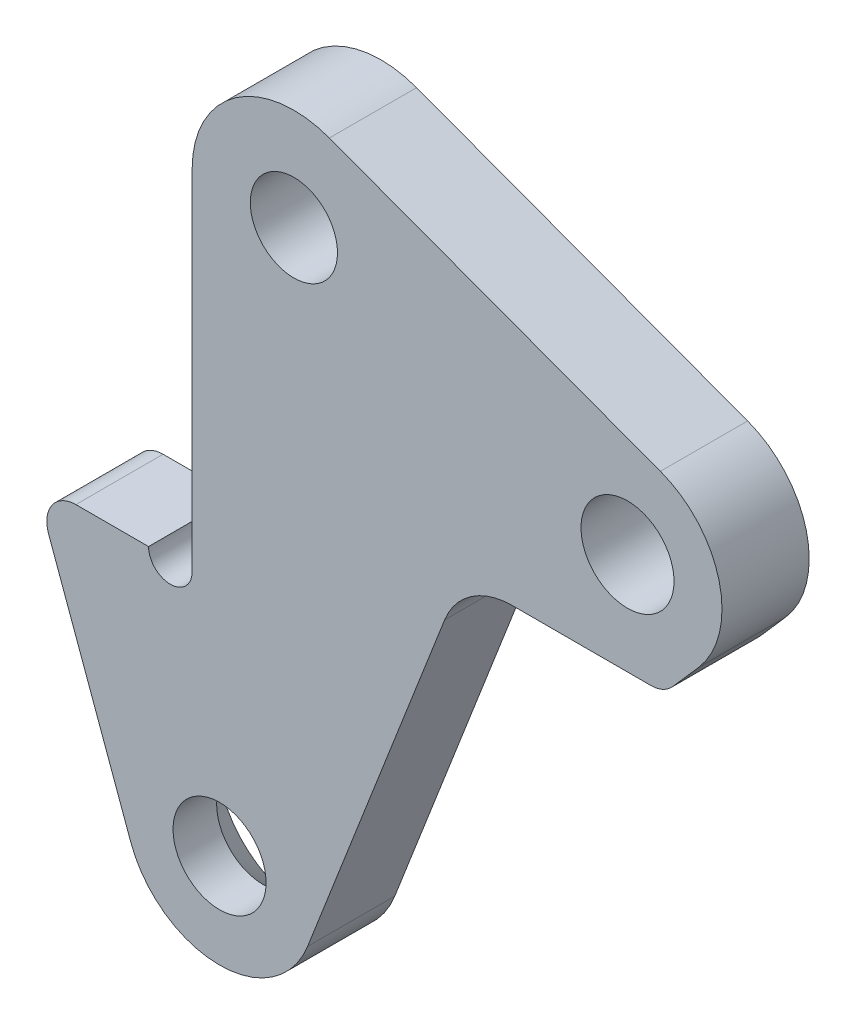
ISO-10303-21;
HEADER;
FILE_DESCRIPTION(('STEP AP214'),'2;1');
FILE_NAME('part.step','',(''),(''),'','','');
FILE_SCHEMA(('AUTOMOTIVE_DESIGN { 1 0 10303 214 1 1 1 1 }'));
ENDSEC;
DATA;
#1=APPLICATION_CONTEXT('core data for automotive mechanical design processes');
#2=APPLICATION_PROTOCOL_DEFINITION('international standard','automotive_design',2000,#1);
#3=PRODUCT_CONTEXT('',#1,'mechanical');
#4=PRODUCT('Part','Part','',(#3));
#5=PRODUCT_RELATED_PRODUCT_CATEGORY('part','',(#4));
#6=PRODUCT_DEFINITION_FORMATION('','',#4);
#7=PRODUCT_DEFINITION_CONTEXT('part definition',#1,'design');
#8=PRODUCT_DEFINITION('design','',#6,#7);
#9=PRODUCT_DEFINITION_SHAPE('','',#8);
#10=(LENGTH_UNIT() NAMED_UNIT(*) SI_UNIT(.MILLI.,.METRE.));
#11=(NAMED_UNIT(*) PLANE_ANGLE_UNIT() SI_UNIT($,.RADIAN.));
#12=(NAMED_UNIT(*) SI_UNIT($,.STERADIAN.) SOLID_ANGLE_UNIT());
#13=UNCERTAINTY_MEASURE_WITH_UNIT(LENGTH_MEASURE(1.E-05),#10,'distance_accuracy_value','');
#14=(GEOMETRIC_REPRESENTATION_CONTEXT(3) GLOBAL_UNCERTAINTY_ASSIGNED_CONTEXT((#13)) GLOBAL_UNIT_ASSIGNED_CONTEXT((#10,
#11,#12)) REPRESENTATION_CONTEXT('',''));
#15=CARTESIAN_POINT('',(0.,0.,0.));
#16=DIRECTION('',(0.,0.,1.));
#17=DIRECTION('',(1.,0.,0.));
#18=AXIS2_PLACEMENT_3D('',#15,#16,#17);
#19=CARTESIAN_POINT('',(0.,0.,1.5));
#20=DIRECTION('',(0.,0.,-1.));
#21=DIRECTION('',(-1.,0.,0.));
#22=AXIS2_PLACEMENT_3D('',#19,#20,#21);
#23=PLANE('',#22);
#24=CARTESIAN_POINT('',(0.,0.,1.5));
#25=DIRECTION('',(0.,0.,1.));
#26=DIRECTION('',(1.,0.,0.));
#27=AXIS2_PLACEMENT_3D('',#24,#25,#26);
#28=CIRCLE('',#27,1.5);
#29=CARTESIAN_POINT('',(1.5,0.,1.5));
#30=VERTEX_POINT('',#29);
#31=EDGE_CURVE('E185',#30,#30,#28,.T.);
#32=ORIENTED_EDGE('',*,*,#31,.F.);
#33=EDGE_LOOP('',(#32));
#34=FACE_BOUND('',#33,.T.);
#35=CARTESIAN_POINT('',(-2.55780837206581,-20.,1.5));
#36=DIRECTION('',(0.,0.,1.));
#37=DIRECTION('',(1.,0.,0.));
#38=AXIS2_PLACEMENT_3D('',#35,#36,#37);
#39=CIRCLE('',#38,1.60000000000001);
#40=CARTESIAN_POINT('',(-0.957808372065798,-20.,1.5));
#41=VERTEX_POINT('',#40);
#42=EDGE_CURVE('E179',#41,#41,#39,.T.);
#43=ORIENTED_EDGE('',*,*,#42,.F.);
#44=EDGE_LOOP('',(#43));
#45=FACE_BOUND('',#44,.T.);
#46=CARTESIAN_POINT('',(11.4771790394003,-4.,1.5));
#47=DIRECTION('',(0.,0.,1.));
#48=DIRECTION('',(1.,0.,0.));
#49=AXIS2_PLACEMENT_3D('',#46,#47,#48);
#50=CIRCLE('',#49,1.6);
#51=CARTESIAN_POINT('',(13.0771790394003,-4.,1.5));
#52=VERTEX_POINT('',#51);
#53=EDGE_CURVE('E176',#52,#52,#50,.T.);
#54=ORIENTED_EDGE('',*,*,#53,.F.);
#55=EDGE_LOOP('',(#54));
#56=FACE_BOUND('',#55,.T.);
#57=DIRECTION('',(-1.,0.,0.));
#58=VECTOR('',#57,1.);
#59=CARTESIAN_POINT('',(5.80742685174699,-7.5,1.5));
#60=LINE('',#59,#58);
#61=CARTESIAN_POINT('',(12.2771829682659,-7.5,1.5));
#62=VERTEX_POINT('',#61);
#63=CARTESIAN_POINT('',(7.51561342335569,-7.5,1.5));
#64=VERTEX_POINT('',#63);
#65=EDGE_CURVE('E148',#62,#64,#60,.T.);
#66=ORIENTED_EDGE('',*,*,#65,.F.);
#67=CARTESIAN_POINT('',(12.2771829682659,-6.5,1.5));
#68=DIRECTION('',(0.,0.,-1.));
#69=DIRECTION('',(-1.,0.,0.));
#70=AXIS2_PLACEMENT_3D('',#67,#68,#69);
#71=CIRCLE('',#70,1.);
#72=CARTESIAN_POINT('',(13.0289444175339,-7.15943515480637,1.5));
#73=VERTEX_POINT('',#72);
#74=EDGE_CURVE('E59',#62,#73,#71,.F.);
#75=ORIENTED_EDGE('',*,*,#74,.T.);
#76=DIRECTION('',(0.659435154806362,0.75176144926799,0.));
#77=VECTOR('',#76,1.);
#78=CARTESIAN_POINT('',(-0.114583661944843,-22.1431642531207,1.5));
#79=LINE('',#78,#77);
#80=CARTESIAN_POINT('',(13.9204037495213,-6.14316425312068,1.5));
#81=VERTEX_POINT('',#80);
#82=EDGE_CURVE('E203',#73,#81,#79,.T.);
#83=ORIENTED_EDGE('',*,*,#82,.T.);
#84=CARTESIAN_POINT('',(11.4771790394003,-4.,1.5));
#85=DIRECTION('',(0.,0.,1.));
#86=DIRECTION('',(1.,0.,0.));
#87=AXIS2_PLACEMENT_3D('',#84,#85,#86);
#88=CIRCLE('',#87,3.25);
#89=CARTESIAN_POINT('',(12.6096632094642,-0.953694105222709,1.5));
#90=VERTEX_POINT('',#89);
#91=EDGE_CURVE('E205',#81,#90,#88,.T.);
#92=ORIENTED_EDGE('',*,*,#91,.T.);
#93=DIRECTION('',(-0.937324890700704,0.348456667711945,0.));
#94=VECTOR('',#93,1.);
#95=CARTESIAN_POINT('',(1.21959833699181,3.28063711745247,1.5));
#96=LINE('',#95,#94);
#97=CARTESIAN_POINT('',(1.21959833699181,3.28063711745247,1.5));
#98=VERTEX_POINT('',#97);
#99=EDGE_CURVE('E207',#90,#98,#96,.T.);
#100=ORIENTED_EDGE('',*,*,#99,.T.);
#101=CARTESIAN_POINT('',(0.,0.,1.5));
#102=DIRECTION('',(0.,0.,1.));
#103=DIRECTION('',(-1.,0.,0.));
#104=AXIS2_PLACEMENT_3D('',#101,#102,#103);
#105=CIRCLE('',#104,3.5);
#106=CARTESIAN_POINT('',(-3.5,0.,1.5));
#107=VERTEX_POINT('',#106);
#108=EDGE_CURVE('E209',#98,#107,#105,.T.);
#109=ORIENTED_EDGE('',*,*,#108,.T.);
#110=DIRECTION('',(0.,-1.,0.));
#111=VECTOR('',#110,1.);
#112=CARTESIAN_POINT('',(-3.5,-12.,1.5));
#113=LINE('',#112,#111);
#114=CARTESIAN_POINT('',(-3.5,-12.,1.5));
#115=VERTEX_POINT('',#114);
#116=EDGE_CURVE('E191',#107,#115,#113,.T.);
#117=ORIENTED_EDGE('',*,*,#116,.T.);
#118=CARTESIAN_POINT('',(-4.25,-12.,1.5));
#119=DIRECTION('',(0.,0.,1.));
#120=DIRECTION('',(1.,0.,0.));
#121=AXIS2_PLACEMENT_3D('',#118,#119,#120);
#122=CIRCLE('',#121,0.75);
#123=CARTESIAN_POINT('',(-5.,-12.,1.5));
#124=VERTEX_POINT('',#123);
#125=EDGE_CURVE('E165',#124,#115,#122,.T.);
#126=ORIENTED_EDGE('',*,*,#125,.F.);
#127=DIRECTION('',(-1.,0.,0.));
#128=VECTOR('',#127,1.);
#129=CARTESIAN_POINT('',(-7.5,-12.,1.5));
#130=LINE('',#129,#128);
#131=CARTESIAN_POINT('',(-7.5,-12.,1.5));
#132=VERTEX_POINT('',#131);
#133=EDGE_CURVE('E194',#124,#132,#130,.T.);
#134=ORIENTED_EDGE('',*,*,#133,.T.);
#135=CARTESIAN_POINT('',(-7.5,-13.,1.5));
#136=DIRECTION('',(0.,0.,1.));
#137=DIRECTION('',(1.,0.,0.));
#138=AXIS2_PLACEMENT_3D('',#135,#136,#137);
#139=CIRCLE('',#138,0.999999999999999);
#140=CARTESIAN_POINT('',(-8.43969262078591,-13.3420201433257,1.5));
#141=VERTEX_POINT('',#140);
#142=EDGE_CURVE('E197',#132,#141,#139,.T.);
#143=ORIENTED_EDGE('',*,*,#142,.T.);
#144=DIRECTION('',(0.342020143325666,-0.939692620785909,0.));
#145=VECTOR('',#144,1.);
#146=CARTESIAN_POINT('',(-8.43969262078591,-13.3420201433257,1.5));
#147=LINE('',#146,#145);
#148=CARTESIAN_POINT('',(-5.61180938962001,-21.1115654658084,1.5));
#149=VERTEX_POINT('',#148);
#150=EDGE_CURVE('E199',#141,#149,#147,.T.);
#151=ORIENTED_EDGE('',*,*,#150,.T.);
#152=CARTESIAN_POINT('',(-2.55780837206581,-20.,1.5));
#153=DIRECTION('',(0.,0.,1.));
#154=DIRECTION('',(1.,0.,0.));
#155=AXIS2_PLACEMENT_3D('',#152,#153,#154);
#156=CIRCLE('',#155,3.25);
#157=CARTESIAN_POINT('',(0.469932731190725,-21.1812213220438,1.5));
#158=VERTEX_POINT('',#157);
#159=EDGE_CURVE('E201',#149,#158,#156,.T.);
#160=ORIENTED_EDGE('',*,*,#159,.T.);
#161=DIRECTION('',(-0.363452714475013,-0.931612647155858,0.));
#162=VECTOR('',#161,1.);
#163=CARTESIAN_POINT('',(0.469932731190727,-21.1812213220438,1.5));
#164=LINE('',#163,#162);
#165=CARTESIAN_POINT('',(5.18658180546604,-9.09136821381247,1.5));
#166=VERTEX_POINT('',#165);
#167=EDGE_CURVE('E163',#166,#158,#164,.T.);
#168=ORIENTED_EDGE('',*,*,#167,.F.);
#169=CARTESIAN_POINT('',(7.51561342335569,-10.,1.5));
#170=DIRECTION('',(0.,0.,-1.));
#171=DIRECTION('',(-1.,0.,0.));
#172=AXIS2_PLACEMENT_3D('',#169,#170,#171);
#173=CIRCLE('',#172,2.5);
#174=EDGE_CURVE('E259',#166,#64,#173,.T.);
#175=ORIENTED_EDGE('',*,*,#174,.T.);
#176=EDGE_LOOP('',(#66,#75,#83,#92,#100,#109,#117,#126,#134,#143,#151,#160,#168,#175));
#177=FACE_BOUND('',#176,.T.);
#178=ADVANCED_FACE('F37',(#34,#45,#56,#177),#23,.F.);
#179=CARTESIAN_POINT('',(0.,0.,-1.5));
#180=DIRECTION('',(0.,0.,-1.));
#181=DIRECTION('',(-1.,0.,0.));
#182=AXIS2_PLACEMENT_3D('',#179,#180,#181);
#183=PLANE('',#182);
#184=CARTESIAN_POINT('',(11.4771790394003,-4.,-1.5));
#185=DIRECTION('',(0.,0.,1.));
#186=DIRECTION('',(1.,0.,0.));
#187=AXIS2_PLACEMENT_3D('',#184,#185,#186);
#188=CIRCLE('',#187,1.6);
#189=CARTESIAN_POINT('',(13.0771790394003,-4.,-1.5));
#190=VERTEX_POINT('',#189);
#191=EDGE_CURVE('E174',#190,#190,#188,.T.);
#192=ORIENTED_EDGE('',*,*,#191,.T.);
#193=EDGE_LOOP('',(#192));
#194=FACE_BOUND('',#193,.T.);
#195=CARTESIAN_POINT('',(0.,0.,-1.5));
#196=DIRECTION('',(0.,0.,1.));
#197=DIRECTION('',(1.,0.,0.));
#198=AXIS2_PLACEMENT_3D('',#195,#196,#197);
#199=CIRCLE('',#198,1.5);
#200=CARTESIAN_POINT('',(1.5,0.,-1.5));
#201=VERTEX_POINT('',#200);
#202=EDGE_CURVE('E184',#201,#201,#199,.T.);
#203=ORIENTED_EDGE('',*,*,#202,.T.);
#204=EDGE_LOOP('',(#203));
#205=FACE_BOUND('',#204,.T.);
#206=CARTESIAN_POINT('',(-2.55780837206581,-20.,-1.5));
#207=DIRECTION('',(0.,0.,-1.));
#208=DIRECTION('',(-1.,0.,0.));
#209=AXIS2_PLACEMENT_3D('',#206,#207,#208);
#210=CIRCLE('',#209,3.10000000000001);
#211=CARTESIAN_POINT('',(-5.65780837206582,-20.,-1.5));
#212=VERTEX_POINT('',#211);
#213=EDGE_CURVE('E245',#212,#212,#210,.F.);
#214=ORIENTED_EDGE('',*,*,#213,.T.);
#215=EDGE_LOOP('',(#214));
#216=FACE_BOUND('',#215,.T.);
#217=DIRECTION('',(0.659435154806362,0.75176144926799,0.));
#218=VECTOR('',#217,1.);
#219=CARTESIAN_POINT('',(-0.114583661944843,-22.1431642531207,-1.5));
#220=LINE('',#219,#218);
#221=CARTESIAN_POINT('',(13.0289444175339,-7.15943515480637,-1.5));
#222=VERTEX_POINT('',#221);
#223=CARTESIAN_POINT('',(13.9204037495213,-6.14316425312068,-1.5));
#224=VERTEX_POINT('',#223);
#225=EDGE_CURVE('E158',#222,#224,#220,.T.);
#226=ORIENTED_EDGE('',*,*,#225,.F.);
#227=CARTESIAN_POINT('',(12.2771829682659,-6.5,-1.5));
#228=DIRECTION('',(0.,0.,-1.));
#229=DIRECTION('',(-1.,0.,0.));
#230=AXIS2_PLACEMENT_3D('',#227,#228,#229);
#231=CIRCLE('',#230,1.);
#232=CARTESIAN_POINT('',(12.2771829682659,-7.5,-1.5));
#233=VERTEX_POINT('',#232);
#234=EDGE_CURVE('E11',#222,#233,#231,.T.);
#235=ORIENTED_EDGE('',*,*,#234,.T.);
#236=DIRECTION('',(-1.,0.,0.));
#237=VECTOR('',#236,1.);
#238=CARTESIAN_POINT('',(5.80742685174699,-7.5,-1.5));
#239=LINE('',#238,#237);
#240=CARTESIAN_POINT('',(7.51561342335569,-7.5,-1.5));
#241=VERTEX_POINT('',#240);
#242=EDGE_CURVE('E147',#233,#241,#239,.T.);
#243=ORIENTED_EDGE('',*,*,#242,.T.);
#244=CARTESIAN_POINT('',(7.51561342335569,-10.,-1.5));
#245=DIRECTION('',(0.,0.,-1.));
#246=DIRECTION('',(-1.,0.,0.));
#247=AXIS2_PLACEMENT_3D('',#244,#245,#246);
#248=CIRCLE('',#247,2.5);
#249=CARTESIAN_POINT('',(5.18658180546604,-9.09136821381247,-1.5));
#250=VERTEX_POINT('',#249);
#251=EDGE_CURVE('E142',#241,#250,#248,.F.);
#252=ORIENTED_EDGE('',*,*,#251,.T.);
#253=DIRECTION('',(-0.363452714475013,-0.931612647155858,0.));
#254=VECTOR('',#253,1.);
#255=CARTESIAN_POINT('',(0.469932731190727,-21.1812213220438,-1.5));
#256=LINE('',#255,#254);
#257=CARTESIAN_POINT('',(0.469932731190725,-21.1812213220438,-1.5));
#258=VERTEX_POINT('',#257);
#259=EDGE_CURVE('E136',#250,#258,#256,.T.);
#260=ORIENTED_EDGE('',*,*,#259,.T.);
#261=CARTESIAN_POINT('',(-2.55780837206581,-20.,-1.5));
#262=DIRECTION('',(0.,0.,1.));
#263=DIRECTION('',(1.,0.,0.));
#264=AXIS2_PLACEMENT_3D('',#261,#262,#263);
#265=CIRCLE('',#264,3.25);
#266=CARTESIAN_POINT('',(-5.61180938962001,-21.1115654658084,-1.5));
#267=VERTEX_POINT('',#266);
#268=EDGE_CURVE('E140',#267,#258,#265,.T.);
#269=ORIENTED_EDGE('',*,*,#268,.F.);
#270=DIRECTION('',(0.342020143325666,-0.939692620785909,0.));
#271=VECTOR('',#270,1.);
#272=CARTESIAN_POINT('',(-8.43969262078591,-13.3420201433257,-1.5));
#273=LINE('',#272,#271);
#274=CARTESIAN_POINT('',(-8.43969262078591,-13.3420201433257,-1.5));
#275=VERTEX_POINT('',#274);
#276=EDGE_CURVE('E159',#275,#267,#273,.T.);
#277=ORIENTED_EDGE('',*,*,#276,.F.);
#278=CARTESIAN_POINT('',(-7.5,-13.,-1.5));
#279=DIRECTION('',(0.,0.,1.));
#280=DIRECTION('',(1.,0.,0.));
#281=AXIS2_PLACEMENT_3D('',#278,#279,#280);
#282=CIRCLE('',#281,0.999999999999999);
#283=CARTESIAN_POINT('',(-7.5,-12.,-1.5));
#284=VERTEX_POINT('',#283);
#285=EDGE_CURVE('E216',#284,#275,#282,.T.);
#286=ORIENTED_EDGE('',*,*,#285,.F.);
#287=DIRECTION('',(-1.,0.,0.));
#288=VECTOR('',#287,1.);
#289=CARTESIAN_POINT('',(-7.5,-12.,-1.5));
#290=LINE('',#289,#288);
#291=CARTESIAN_POINT('',(-5.,-12.,-1.5));
#292=VERTEX_POINT('',#291);
#293=EDGE_CURVE('E214',#292,#284,#290,.T.);
#294=ORIENTED_EDGE('',*,*,#293,.F.);
#295=CARTESIAN_POINT('',(-4.25,-12.,-1.5));
#296=DIRECTION('',(0.,0.,1.));
#297=DIRECTION('',(1.,0.,0.));
#298=AXIS2_PLACEMENT_3D('',#295,#296,#297);
#299=CIRCLE('',#298,0.75);
#300=CARTESIAN_POINT('',(-3.5,-12.,-1.5));
#301=VERTEX_POINT('',#300);
#302=EDGE_CURVE('E167',#292,#301,#299,.T.);
#303=ORIENTED_EDGE('',*,*,#302,.T.);
#304=DIRECTION('',(0.,-1.,0.));
#305=VECTOR('',#304,1.);
#306=CARTESIAN_POINT('',(-3.5,-12.,-1.5));
#307=LINE('',#306,#305);
#308=CARTESIAN_POINT('',(-3.5,0.,-1.5));
#309=VERTEX_POINT('',#308);
#310=EDGE_CURVE('E188',#309,#301,#307,.T.);
#311=ORIENTED_EDGE('',*,*,#310,.F.);
#312=CARTESIAN_POINT('',(0.,0.,-1.5));
#313=DIRECTION('',(0.,0.,1.));
#314=DIRECTION('',(-1.,0.,0.));
#315=AXIS2_PLACEMENT_3D('',#312,#313,#314);
#316=CIRCLE('',#315,3.5);
#317=CARTESIAN_POINT('',(1.21959833699181,3.28063711745247,-1.5));
#318=VERTEX_POINT('',#317);
#319=EDGE_CURVE('E195',#318,#309,#316,.T.);
#320=ORIENTED_EDGE('',*,*,#319,.F.);
#321=DIRECTION('',(-0.937324890700704,0.348456667711945,0.));
#322=VECTOR('',#321,1.);
#323=CARTESIAN_POINT('',(1.21959833699181,3.28063711745247,-1.5));
#324=LINE('',#323,#322);
#325=CARTESIAN_POINT('',(12.6096632094642,-0.953694105222709,-1.5));
#326=VERTEX_POINT('',#325);
#327=EDGE_CURVE('E222',#326,#318,#324,.T.);
#328=ORIENTED_EDGE('',*,*,#327,.F.);
#329=CARTESIAN_POINT('',(11.4771790394003,-4.,-1.5));
#330=DIRECTION('',(0.,0.,1.));
#331=DIRECTION('',(1.,0.,0.));
#332=AXIS2_PLACEMENT_3D('',#329,#330,#331);
#333=CIRCLE('',#332,3.25);
#334=EDGE_CURVE('E220',#224,#326,#333,.T.);
#335=ORIENTED_EDGE('',*,*,#334,.F.);
#336=EDGE_LOOP('',(#226,#235,#243,#252,#260,#269,#277,#286,#294,#303,#311,#320,#328,#335));
#337=FACE_BOUND('',#336,.T.);
#338=ADVANCED_FACE('F138',(#194,#205,#216,#337),#183,.T.);
#339=CARTESIAN_POINT('',(-3.5,-12.,1.5));
#340=DIRECTION('',(1.,0.,0.));
#341=DIRECTION('',(0.,0.,-1.));
#342=AXIS2_PLACEMENT_3D('',#339,#340,#341);
#343=PLANE('',#342);
#344=ORIENTED_EDGE('',*,*,#310,.T.);
#345=DIRECTION('',(0.,0.,-1.));
#346=VECTOR('',#345,1.);
#347=CARTESIAN_POINT('',(-3.5,-12.,1.5));
#348=LINE('',#347,#346);
#349=EDGE_CURVE('E243',#115,#301,#348,.T.);
#350=ORIENTED_EDGE('',*,*,#349,.F.);
#351=ORIENTED_EDGE('',*,*,#116,.F.);
#352=DIRECTION('',(0.,0.,-1.));
#353=VECTOR('',#352,1.);
#354=CARTESIAN_POINT('',(-3.5,0.,1.5));
#355=LINE('',#354,#353);
#356=EDGE_CURVE('E211',#107,#309,#355,.T.);
#357=ORIENTED_EDGE('',*,*,#356,.T.);
#358=EDGE_LOOP('',(#344,#350,#351,#357));
#359=FACE_BOUND('',#358,.T.);
#360=ADVANCED_FACE('F288',(#359),#343,.F.);
#361=CARTESIAN_POINT('',(-7.5,-12.,1.5));
#362=DIRECTION('',(0.,-1.,0.));
#363=DIRECTION('',(0.,0.,-1.));
#364=AXIS2_PLACEMENT_3D('',#361,#362,#363);
#365=PLANE('',#364);
#366=ORIENTED_EDGE('',*,*,#133,.F.);
#367=DIRECTION('',(0.,0.,1.));
#368=VECTOR('',#367,1.);
#369=CARTESIAN_POINT('',(-5.,-12.,-1.5));
#370=LINE('',#369,#368);
#371=EDGE_CURVE('E251',#124,#292,#370,.F.);
#372=ORIENTED_EDGE('',*,*,#371,.T.);
#373=ORIENTED_EDGE('',*,*,#293,.T.);
#374=DIRECTION('',(0.,0.,-1.));
#375=VECTOR('',#374,1.);
#376=CARTESIAN_POINT('',(-7.5,-12.,1.5));
#377=LINE('',#376,#375);
#378=EDGE_CURVE('E240',#132,#284,#377,.T.);
#379=ORIENTED_EDGE('',*,*,#378,.F.);
#380=EDGE_LOOP('',(#366,#372,#373,#379));
#381=FACE_BOUND('',#380,.T.);
#382=ADVANCED_FACE('F321',(#381),#365,.F.);
#383=CARTESIAN_POINT('',(-7.5,-13.,1.5));
#384=DIRECTION('',(0.,0.,-1.));
#385=DIRECTION('',(-1.,0.,0.));
#386=AXIS2_PLACEMENT_3D('',#383,#384,#385);
#387=CYLINDRICAL_SURFACE('',#386,0.999999999999999);
#388=ORIENTED_EDGE('',*,*,#285,.T.);
#389=DIRECTION('',(0.,0.,-1.));
#390=VECTOR('',#389,1.);
#391=CARTESIAN_POINT('',(-8.43969262078591,-13.3420201433257,1.5));
#392=LINE('',#391,#390);
#393=EDGE_CURVE('E237',#141,#275,#392,.T.);
#394=ORIENTED_EDGE('',*,*,#393,.F.);
#395=ORIENTED_EDGE('',*,*,#142,.F.);
#396=ORIENTED_EDGE('',*,*,#378,.T.);
#397=EDGE_LOOP('',(#388,#394,#395,#396));
#398=FACE_BOUND('',#397,.T.);
#399=ADVANCED_FACE('F317',(#398),#387,.T.);
#400=CARTESIAN_POINT('',(-8.43969262078591,-13.3420201433257,1.5));
#401=DIRECTION('',(0.939692620785909,0.342020143325666,0.));
#402=DIRECTION('',(-0.342020143325666,0.93969262078591,0.));
#403=AXIS2_PLACEMENT_3D('',#400,#401,#402);
#404=PLANE('',#403);
#405=ORIENTED_EDGE('',*,*,#276,.T.);
#406=DIRECTION('',(0.,0.,-1.));
#407=VECTOR('',#406,1.);
#408=CARTESIAN_POINT('',(-5.61180938962001,-21.1115654658084,1.5));
#409=LINE('',#408,#407);
#410=EDGE_CURVE('E157',#149,#267,#409,.T.);
#411=ORIENTED_EDGE('',*,*,#410,.F.);
#412=ORIENTED_EDGE('',*,*,#150,.F.);
#413=ORIENTED_EDGE('',*,*,#393,.T.);
#414=EDGE_LOOP('',(#405,#411,#412,#413));
#415=FACE_BOUND('',#414,.T.);
#416=ADVANCED_FACE('F314',(#415),#404,.F.);
#417=CARTESIAN_POINT('',(-2.55780837206581,-20.,1.5));
#418=DIRECTION('',(0.,0.,-1.));
#419=DIRECTION('',(-1.,0.,0.));
#420=AXIS2_PLACEMENT_3D('',#417,#418,#419);
#421=CYLINDRICAL_SURFACE('',#420,3.25);
#422=ORIENTED_EDGE('',*,*,#268,.T.);
#423=DIRECTION('',(0.,0.,1.));
#424=VECTOR('',#423,1.);
#425=CARTESIAN_POINT('',(0.469932731190725,-21.1812213220438,-1.5));
#426=LINE('',#425,#424);
#427=EDGE_CURVE('E155',#258,#158,#426,.T.);
#428=ORIENTED_EDGE('',*,*,#427,.T.);
#429=ORIENTED_EDGE('',*,*,#159,.F.);
#430=ORIENTED_EDGE('',*,*,#410,.T.);
#431=EDGE_LOOP('',(#422,#428,#429,#430));
#432=FACE_BOUND('',#431,.T.);
#433=ADVANCED_FACE('F153',(#432),#421,.T.);
#434=CARTESIAN_POINT('',(-0.114583661944843,-22.1431642531207,1.5));
#435=DIRECTION('',(-0.75176144926799,0.659435154806362,0.));
#436=DIRECTION('',(-0.659435154806362,-0.75176144926799,0.));
#437=AXIS2_PLACEMENT_3D('',#434,#435,#436);
#438=PLANE('',#437);
#439=ORIENTED_EDGE('',*,*,#82,.F.);
#440=DIRECTION('',(0.,0.,1.));
#441=VECTOR('',#440,1.);
#442=CARTESIAN_POINT('',(13.0289444175339,-7.15943515480636,1.5));
#443=LINE('',#442,#441);
#444=EDGE_CURVE('E45',#73,#222,#443,.F.);
#445=ORIENTED_EDGE('',*,*,#444,.T.);
#446=ORIENTED_EDGE('',*,*,#225,.T.);
#447=DIRECTION('',(0.,0.,-1.));
#448=VECTOR('',#447,1.);
#449=CARTESIAN_POINT('',(13.9204037495213,-6.14316425312068,1.5));
#450=LINE('',#449,#448);
#451=EDGE_CURVE('E233',#81,#224,#450,.T.);
#452=ORIENTED_EDGE('',*,*,#451,.F.);
#453=EDGE_LOOP('',(#439,#445,#446,#452));
#454=FACE_BOUND('',#453,.T.);
#455=ADVANCED_FACE('F308',(#454),#438,.F.);
#456=CARTESIAN_POINT('',(11.4771790394003,-4.,1.5));
#457=DIRECTION('',(0.,0.,-1.));
#458=DIRECTION('',(-1.,0.,0.));
#459=AXIS2_PLACEMENT_3D('',#456,#457,#458);
#460=CYLINDRICAL_SURFACE('',#459,3.25);
#461=ORIENTED_EDGE('',*,*,#334,.T.);
#462=DIRECTION('',(0.,0.,-1.));
#463=VECTOR('',#462,1.);
#464=CARTESIAN_POINT('',(12.6096632094642,-0.953694105222709,1.5));
#465=LINE('',#464,#463);
#466=EDGE_CURVE('E230',#90,#326,#465,.T.);
#467=ORIENTED_EDGE('',*,*,#466,.F.);
#468=ORIENTED_EDGE('',*,*,#91,.F.);
#469=ORIENTED_EDGE('',*,*,#451,.T.);
#470=EDGE_LOOP('',(#461,#467,#468,#469));
#471=FACE_BOUND('',#470,.T.);
#472=ADVANCED_FACE('F304',(#471),#460,.T.);
#473=CARTESIAN_POINT('',(1.21959833699181,3.28063711745247,1.5));
#474=DIRECTION('',(-0.348456667711945,-0.937324890700704,0.));
#475=DIRECTION('',(0.937324890700705,-0.348456667711945,0.));
#476=AXIS2_PLACEMENT_3D('',#473,#474,#475);
#477=PLANE('',#476);
#478=ORIENTED_EDGE('',*,*,#327,.T.);
#479=DIRECTION('',(0.,0.,-1.));
#480=VECTOR('',#479,1.);
#481=CARTESIAN_POINT('',(1.21959833699181,3.28063711745247,1.5));
#482=LINE('',#481,#480);
#483=EDGE_CURVE('E227',#98,#318,#482,.T.);
#484=ORIENTED_EDGE('',*,*,#483,.F.);
#485=ORIENTED_EDGE('',*,*,#99,.F.);
#486=ORIENTED_EDGE('',*,*,#466,.T.);
#487=EDGE_LOOP('',(#478,#484,#485,#486));
#488=FACE_BOUND('',#487,.T.);
#489=ADVANCED_FACE('F300',(#488),#477,.F.);
#490=CARTESIAN_POINT('',(0.,0.,1.5));
#491=DIRECTION('',(0.,0.,-1.));
#492=DIRECTION('',(-1.,0.,0.));
#493=AXIS2_PLACEMENT_3D('',#490,#491,#492);
#494=CYLINDRICAL_SURFACE('',#493,3.5);
#495=ORIENTED_EDGE('',*,*,#319,.T.);
#496=ORIENTED_EDGE('',*,*,#356,.F.);
#497=ORIENTED_EDGE('',*,*,#108,.F.);
#498=ORIENTED_EDGE('',*,*,#483,.T.);
#499=EDGE_LOOP('',(#495,#496,#497,#498));
#500=FACE_BOUND('',#499,.T.);
#501=ADVANCED_FACE('F297',(#500),#494,.T.);
#502=CARTESIAN_POINT('',(0.,0.,1.5));
#503=DIRECTION('',(0.,0.,-1.));
#504=DIRECTION('',(-1.,0.,0.));
#505=AXIS2_PLACEMENT_3D('',#502,#503,#504);
#506=CYLINDRICAL_SURFACE('',#505,1.5);
#507=ORIENTED_EDGE('',*,*,#31,.T.);
#508=EDGE_LOOP('',(#507));
#509=FACE_BOUND('',#508,.T.);
#510=ORIENTED_EDGE('',*,*,#202,.F.);
#511=EDGE_LOOP('',(#510));
#512=FACE_BOUND('',#511,.T.);
#513=ADVANCED_FACE('F294',(#509,#512),#506,.F.);
#514=CARTESIAN_POINT('',(-2.55780837206581,-20.,1.5));
#515=DIRECTION('',(0.,0.,-1.));
#516=DIRECTION('',(-1.,0.,0.));
#517=AXIS2_PLACEMENT_3D('',#514,#515,#516);
#518=CYLINDRICAL_SURFACE('',#517,1.60000000000001);
#519=CARTESIAN_POINT('',(-2.55780837206581,-20.,0.));
#520=DIRECTION('',(0.,0.,-1.));
#521=DIRECTION('',(-1.,0.,0.));
#522=AXIS2_PLACEMENT_3D('',#519,#520,#521);
#523=CIRCLE('',#522,1.60000000000001);
#524=CARTESIAN_POINT('',(-4.15780837206582,-20.,0.));
#525=VERTEX_POINT('',#524);
#526=EDGE_CURVE('E248',#525,#525,#523,.T.);
#527=ORIENTED_EDGE('',*,*,#526,.T.);
#528=EDGE_LOOP('',(#527));
#529=FACE_BOUND('',#528,.T.);
#530=ORIENTED_EDGE('',*,*,#42,.T.);
#531=EDGE_LOOP('',(#530));
#532=FACE_BOUND('',#531,.T.);
#533=ADVANCED_FACE('F342',(#529,#532),#518,.F.);
#534=CARTESIAN_POINT('',(11.4771790394003,-4.,1.5));
#535=DIRECTION('',(0.,0.,-1.));
#536=DIRECTION('',(-1.,0.,0.));
#537=AXIS2_PLACEMENT_3D('',#534,#535,#536);
#538=CYLINDRICAL_SURFACE('',#537,1.6);
#539=ORIENTED_EDGE('',*,*,#53,.T.);
#540=EDGE_LOOP('',(#539));
#541=FACE_BOUND('',#540,.T.);
#542=ORIENTED_EDGE('',*,*,#191,.F.);
#543=EDGE_LOOP('',(#542));
#544=FACE_BOUND('',#543,.T.);
#545=ADVANCED_FACE('F334',(#541,#544),#538,.F.);
#546=CARTESIAN_POINT('',(-2.55780837206581,-20.,-1.5));
#547=DIRECTION('',(0.,0.,-1.));
#548=DIRECTION('',(-1.,0.,0.));
#549=AXIS2_PLACEMENT_3D('',#546,#547,#548);
#550=CONICAL_SURFACE('',#549,3.10000000000001,0.785398163397446);
#551=ORIENTED_EDGE('',*,*,#526,.F.);
#552=EDGE_LOOP('',(#551));
#553=FACE_BOUND('',#552,.T.);
#554=ORIENTED_EDGE('',*,*,#213,.F.);
#555=EDGE_LOOP('',(#554));
#556=FACE_BOUND('',#555,.T.);
#557=ADVANCED_FACE('F329',(#553,#556),#550,.F.);
#558=CARTESIAN_POINT('',(-4.25,-12.,-1.5));
#559=DIRECTION('',(0.,0.,1.));
#560=DIRECTION('',(1.,0.,0.));
#561=AXIS2_PLACEMENT_3D('',#558,#559,#560);
#562=CYLINDRICAL_SURFACE('',#561,0.75);
#563=ORIENTED_EDGE('',*,*,#302,.F.);
#564=ORIENTED_EDGE('',*,*,#371,.F.);
#565=ORIENTED_EDGE('',*,*,#125,.T.);
#566=ORIENTED_EDGE('',*,*,#349,.T.);
#567=EDGE_LOOP('',(#563,#564,#565,#566));
#568=FACE_BOUND('',#567,.T.);
#569=ADVANCED_FACE('F333',(#568),#562,.F.);
#570=CARTESIAN_POINT('',(0.469932731190727,-21.1812213220438,-1.5));
#571=DIRECTION('',(-0.931612647155858,0.363452714475013,0.));
#572=DIRECTION('',(-0.363452714475013,-0.931612647155858,0.));
#573=AXIS2_PLACEMENT_3D('',#570,#571,#572);
#574=PLANE('',#573);
#575=ORIENTED_EDGE('',*,*,#259,.F.);
#576=DIRECTION('',(0.,0.,1.));
#577=VECTOR('',#576,1.);
#578=CARTESIAN_POINT('',(5.18658180546604,-9.09136821381247,1.5));
#579=LINE('',#578,#577);
#580=EDGE_CURVE('E254',#250,#166,#579,.T.);
#581=ORIENTED_EDGE('',*,*,#580,.T.);
#582=ORIENTED_EDGE('',*,*,#167,.T.);
#583=ORIENTED_EDGE('',*,*,#427,.F.);
#584=EDGE_LOOP('',(#575,#581,#582,#583));
#585=FACE_BOUND('',#584,.T.);
#586=ADVANCED_FACE('F161',(#585),#574,.F.);
#587=CARTESIAN_POINT('',(5.80742685174699,-7.5,-1.5));
#588=DIRECTION('',(0.,1.,0.));
#589=DIRECTION('',(-1.,0.,0.));
#590=AXIS2_PLACEMENT_3D('',#587,#588,#589);
#591=PLANE('',#590);
#592=ORIENTED_EDGE('',*,*,#242,.F.);
#593=DIRECTION('',(0.,0.,1.));
#594=VECTOR('',#593,1.);
#595=CARTESIAN_POINT('',(12.2771829682659,-7.5,-1.5));
#596=LINE('',#595,#594);
#597=EDGE_CURVE('E263',#233,#62,#596,.T.);
#598=ORIENTED_EDGE('',*,*,#597,.T.);
#599=ORIENTED_EDGE('',*,*,#65,.T.);
#600=DIRECTION('',(0.,0.,1.));
#601=VECTOR('',#600,1.);
#602=CARTESIAN_POINT('',(7.51561342335569,-7.5,-1.5));
#603=LINE('',#602,#601);
#604=EDGE_CURVE('E256',#64,#241,#603,.F.);
#605=ORIENTED_EDGE('',*,*,#604,.T.);
#606=EDGE_LOOP('',(#592,#598,#599,#605));
#607=FACE_BOUND('',#606,.T.);
#608=ADVANCED_FACE('F269',(#607),#591,.F.);
#609=CARTESIAN_POINT('',(7.51561342335569,-10.,-1.5));
#610=DIRECTION('',(0.,0.,-1.));
#611=DIRECTION('',(-1.,0.,0.));
#612=AXIS2_PLACEMENT_3D('',#609,#610,#611);
#613=CYLINDRICAL_SURFACE('',#612,2.5);
#614=ORIENTED_EDGE('',*,*,#251,.F.);
#615=ORIENTED_EDGE('',*,*,#604,.F.);
#616=ORIENTED_EDGE('',*,*,#174,.F.);
#617=ORIENTED_EDGE('',*,*,#580,.F.);
#618=EDGE_LOOP('',(#614,#615,#616,#617));
#619=FACE_BOUND('',#618,.T.);
#620=ADVANCED_FACE('F274',(#619),#613,.F.);
#621=CARTESIAN_POINT('',(12.2771829682659,-6.5,-1.5));
#622=DIRECTION('',(0.,0.,1.));
#623=DIRECTION('',(1.,0.,0.));
#624=AXIS2_PLACEMENT_3D('',#621,#622,#623);
#625=CYLINDRICAL_SURFACE('',#624,1.);
#626=ORIENTED_EDGE('',*,*,#234,.F.);
#627=ORIENTED_EDGE('',*,*,#444,.F.);
#628=ORIENTED_EDGE('',*,*,#74,.F.);
#629=ORIENTED_EDGE('',*,*,#597,.F.);
#630=EDGE_LOOP('',(#626,#627,#628,#629));
#631=FACE_BOUND('',#630,.T.);
#632=ADVANCED_FACE('F39',(#631),#625,.T.);
#633=CLOSED_SHELL('',(#178,#338,#360,#382,#399,#416,#433,#455,#472,#489,#501,#513,#533,#545,
#557,#569,#586,#608,#620,#632));
#634=MANIFOLD_SOLID_BREP('B2',#633);
#635=ADVANCED_BREP_SHAPE_REPRESENTATION('',(#18,#634),#14);
#636=SHAPE_DEFINITION_REPRESENTATION(#9,#635);
ENDSEC;
END-ISO-10303-21;
